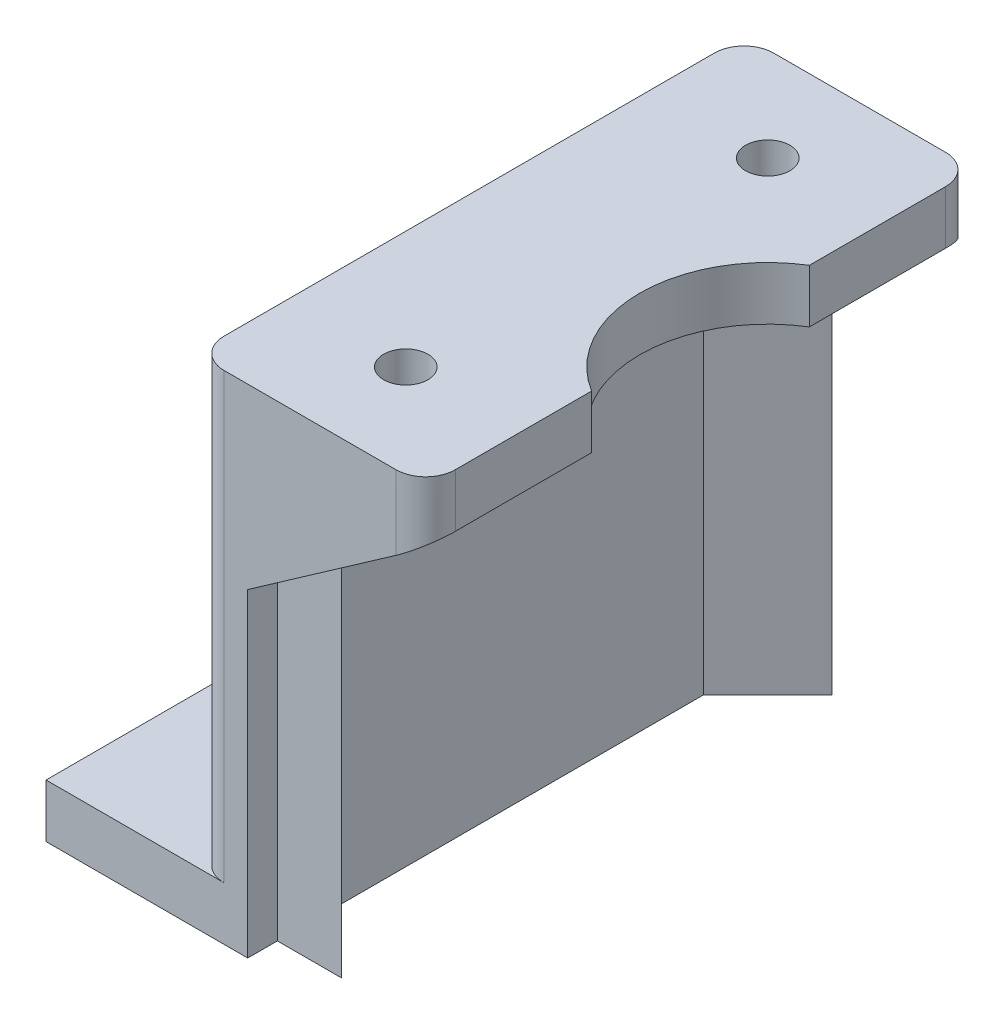
ISO-10303-21;
HEADER;
FILE_DESCRIPTION(('STEP AP214'),'2;1');
FILE_NAME('part.step','',(''),(''),'','','');
FILE_SCHEMA(('AUTOMOTIVE_DESIGN { 1 0 10303 214 1 1 1 1 }'));
ENDSEC;
DATA;
#1=APPLICATION_CONTEXT('core data for automotive mechanical design processes');
#2=APPLICATION_PROTOCOL_DEFINITION('international standard','automotive_design',2000,#1);
#3=PRODUCT_CONTEXT('',#1,'mechanical');
#4=PRODUCT('Part','Part','',(#3));
#5=PRODUCT_RELATED_PRODUCT_CATEGORY('part','',(#4));
#6=PRODUCT_DEFINITION_FORMATION('','',#4);
#7=PRODUCT_DEFINITION_CONTEXT('part definition',#1,'design');
#8=PRODUCT_DEFINITION('design','',#6,#7);
#9=PRODUCT_DEFINITION_SHAPE('','',#8);
#10=(LENGTH_UNIT() NAMED_UNIT(*) SI_UNIT(.MILLI.,.METRE.));
#11=(NAMED_UNIT(*) PLANE_ANGLE_UNIT() SI_UNIT($,.RADIAN.));
#12=(NAMED_UNIT(*) SI_UNIT($,.STERADIAN.) SOLID_ANGLE_UNIT());
#13=UNCERTAINTY_MEASURE_WITH_UNIT(LENGTH_MEASURE(1.E-05),#10,'distance_accuracy_value','');
#14=(GEOMETRIC_REPRESENTATION_CONTEXT(3) GLOBAL_UNCERTAINTY_ASSIGNED_CONTEXT((#13)) GLOBAL_UNIT_ASSIGNED_CONTEXT((#10,
#11,#12)) REPRESENTATION_CONTEXT('',''));
#15=CARTESIAN_POINT('',(0.,0.,0.));
#16=DIRECTION('',(0.,0.,1.));
#17=DIRECTION('',(1.,0.,0.));
#18=AXIS2_PLACEMENT_3D('',#15,#16,#17);
#19=CARTESIAN_POINT('',(0.,39.77894,47.0789));
#20=DIRECTION('',(0.,-1.,0.));
#21=DIRECTION('',(0.,0.,-1.));
#22=AXIS2_PLACEMENT_3D('',#19,#20,#21);
#23=PLANE('',#22);
#24=CARTESIAN_POINT('',(-36.4998,39.77894,8.0391));
#25=DIRECTION('',(0.,-1.,0.));
#26=DIRECTION('',(0.,0.,-1.));
#27=AXIS2_PLACEMENT_3D('',#24,#25,#26);
#28=CIRCLE('',#27,1.89864999999999);
#29=CARTESIAN_POINT('',(-36.4998,39.77894,6.14045000000001));
#30=VERTEX_POINT('',#29);
#31=EDGE_CURVE('E246',#30,#30,#28,.T.);
#32=ORIENTED_EDGE('',*,*,#31,.F.);
#33=EDGE_LOOP('',(#32));
#34=FACE_BOUND('',#33,.T.);
#35=CARTESIAN_POINT('',(-36.4998,39.77894,39.0398));
#36=DIRECTION('',(0.,-1.,0.));
#37=DIRECTION('',(0.,0.,-1.));
#38=AXIS2_PLACEMENT_3D('',#35,#36,#37);
#39=CIRCLE('',#38,1.89864999999999);
#40=CARTESIAN_POINT('',(-36.4998,39.77894,37.14115));
#41=VERTEX_POINT('',#40);
#42=EDGE_CURVE('E252',#41,#41,#39,.T.);
#43=ORIENTED_EDGE('',*,*,#42,.F.);
#44=EDGE_LOOP('',(#43));
#45=FACE_BOUND('',#44,.T.);
#46=DIRECTION('',(0.,0.,-1.));
#47=VECTOR('',#46,1.);
#48=CARTESIAN_POINT('',(-41.9989,39.77894,47.0789));
#49=LINE('',#48,#47);
#50=CARTESIAN_POINT('',(-41.9989,39.77894,39.0398));
#51=VERTEX_POINT('',#50);
#52=CARTESIAN_POINT('',(-41.9989,39.77894,8.0391));
#53=VERTEX_POINT('',#52);
#54=EDGE_CURVE('E320',#51,#53,#49,.T.);
#55=ORIENTED_EDGE('',*,*,#54,.T.);
#56=DIRECTION('',(-0.707106781186547,0.,0.707106781186547));
#57=VECTOR('',#56,1.);
#58=CARTESIAN_POINT('',(-36.4998,39.77894,2.54));
#59=LINE('',#58,#57);
#60=CARTESIAN_POINT('',(-36.4998,39.77894,2.54));
#61=VERTEX_POINT('',#60);
#62=EDGE_CURVE('E189',#61,#53,#59,.T.);
#63=ORIENTED_EDGE('',*,*,#62,.F.);
#64=DIRECTION('',(-1.,0.,0.));
#65=VECTOR('',#64,1.);
#66=CARTESIAN_POINT('',(-41.9989,39.77894,2.54));
#67=LINE('',#66,#65);
#68=CARTESIAN_POINT('',(-26.7589,39.77894,2.54));
#69=VERTEX_POINT('',#68);
#70=EDGE_CURVE('E256',#69,#61,#67,.T.);
#71=ORIENTED_EDGE('',*,*,#70,.F.);
#72=DIRECTION('',(0.,0.,-1.));
#73=VECTOR('',#72,1.);
#74=CARTESIAN_POINT('',(-26.7589,39.77894,47.0789));
#75=LINE('',#74,#73);
#76=CARTESIAN_POINT('',(-26.7589,39.77894,14.2138317846965));
#77=VERTEX_POINT('',#76);
#78=EDGE_CURVE('E316',#77,#69,#75,.T.);
#79=ORIENTED_EDGE('',*,*,#78,.F.);
#80=CARTESIAN_POINT('',(-21.00072,39.77894,23.53945));
#81=DIRECTION('',(0.,-1.,0.));
#82=DIRECTION('',(0.,0.,-1.));
#83=AXIS2_PLACEMENT_3D('',#80,#81,#82);
#84=CIRCLE('',#83,10.9601);
#85=CARTESIAN_POINT('',(-26.7589,39.77894,32.8650682153035));
#86=VERTEX_POINT('',#85);
#87=EDGE_CURVE('E240',#86,#77,#84,.T.);
#88=ORIENTED_EDGE('',*,*,#87,.F.);
#89=CARTESIAN_POINT('',(-26.7589,39.77894,44.5389));
#90=VERTEX_POINT('',#89);
#91=EDGE_CURVE('E319',#90,#86,#75,.T.);
#92=ORIENTED_EDGE('',*,*,#91,.F.);
#93=DIRECTION('',(-1.,0.,0.));
#94=VECTOR('',#93,1.);
#95=CARTESIAN_POINT('',(-41.9989,39.77894,44.5389));
#96=LINE('',#95,#94);
#97=CARTESIAN_POINT('',(-36.4998,39.77894,44.5389));
#98=VERTEX_POINT('',#97);
#99=EDGE_CURVE('E266',#90,#98,#96,.T.);
#100=ORIENTED_EDGE('',*,*,#99,.T.);
#101=DIRECTION('',(0.707106781186547,0.,0.707106781186547));
#102=VECTOR('',#101,1.);
#103=CARTESIAN_POINT('',(-41.9989,39.77894,39.0398));
#104=LINE('',#103,#102);
#105=EDGE_CURVE('E205',#51,#98,#104,.T.);
#106=ORIENTED_EDGE('',*,*,#105,.F.);
#107=EDGE_LOOP('',(#55,#63,#71,#79,#88,#92,#100,#106));
#108=FACE_BOUND('',#107,.T.);
#109=ADVANCED_FACE('F35',(#34,#45,#108),#23,.T.);
#110=CARTESIAN_POINT('',(-41.9989,0.,47.0789));
#111=DIRECTION('',(1.,0.,0.));
#112=DIRECTION('',(0.,1.,0.));
#113=AXIS2_PLACEMENT_3D('',#110,#111,#112);
#114=PLANE('',#113);
#115=DIRECTION('',(0.,0.,-1.));
#116=VECTOR('',#115,1.);
#117=CARTESIAN_POINT('',(-41.9989,29.1109399999997,2.54));
#118=LINE('',#117,#116);
#119=CARTESIAN_POINT('',(-41.9989,29.1109399999997,2.54));
#120=VERTEX_POINT('',#119);
#121=CARTESIAN_POINT('',(-41.9989,29.1109399999998,0.));
#122=VERTEX_POINT('',#121);
#123=EDGE_CURVE('E260',#120,#122,#118,.T.);
#124=ORIENTED_EDGE('',*,*,#123,.F.);
#125=DIRECTION('',(0.,1.,0.));
#126=VECTOR('',#125,1.);
#127=CARTESIAN_POINT('',(-41.9989,1.778,2.54));
#128=LINE('',#127,#126);
#129=CARTESIAN_POINT('',(-41.9989,1.778,2.53999999999999));
#130=VERTEX_POINT('',#129);
#131=EDGE_CURVE('E58',#130,#120,#128,.T.);
#132=ORIENTED_EDGE('',*,*,#131,.F.);
#133=DIRECTION('',(0.,0.,-1.));
#134=VECTOR('',#133,1.);
#135=CARTESIAN_POINT('',(-41.9989,1.778,47.0789));
#136=LINE('',#135,#134);
#137=CARTESIAN_POINT('',(-41.9989,1.778,0.));
#138=VERTEX_POINT('',#137);
#139=EDGE_CURVE('E187',#130,#138,#136,.T.);
#140=ORIENTED_EDGE('',*,*,#139,.T.);
#141=DIRECTION('',(0.,-1.,0.));
#142=VECTOR('',#141,1.);
#143=CARTESIAN_POINT('',(-41.9989,0.,0.));
#144=LINE('',#143,#142);
#145=EDGE_CURVE('E298',#122,#138,#144,.T.);
#146=ORIENTED_EDGE('',*,*,#145,.F.);
#147=EDGE_LOOP('',(#124,#132,#140,#146));
#148=FACE_BOUND('',#147,.T.);
#149=ADVANCED_FACE('F450',(#148),#114,.T.);
#150=CARTESIAN_POINT('',(-41.9989,1.778,39.0398));
#151=VERTEX_POINT('',#150);
#152=CARTESIAN_POINT('',(-41.9989,1.778,8.03910000000002));
#153=VERTEX_POINT('',#152);
#154=EDGE_CURVE('E325',#151,#153,#136,.T.);
#155=ORIENTED_EDGE('',*,*,#154,.T.);
#156=DIRECTION('',(0.,1.,0.));
#157=VECTOR('',#156,1.);
#158=CARTESIAN_POINT('',(-41.9989,1.778,8.0391));
#159=LINE('',#158,#157);
#160=EDGE_CURVE('E50',#153,#53,#159,.T.);
#161=ORIENTED_EDGE('',*,*,#160,.T.);
#162=ORIENTED_EDGE('',*,*,#54,.F.);
#163=DIRECTION('',(0.,1.,0.));
#164=VECTOR('',#163,1.);
#165=CARTESIAN_POINT('',(-41.9989,1.778,39.0398));
#166=LINE('',#165,#164);
#167=EDGE_CURVE('E216',#151,#51,#166,.T.);
#168=ORIENTED_EDGE('',*,*,#167,.F.);
#169=EDGE_LOOP('',(#155,#161,#162,#168));
#170=FACE_BOUND('',#169,.T.);
#171=ADVANCED_FACE('F380',(#170),#114,.T.);
#172=CARTESIAN_POINT('',(0.,0.,2.54));
#173=DIRECTION('',(0.,0.,-1.));
#174=DIRECTION('',(1.,0.,0.));
#175=AXIS2_PLACEMENT_3D('',#172,#173,#174);
#176=PLANE('',#175);
#177=DIRECTION('',(0.,1.,0.));
#178=VECTOR('',#177,1.);
#179=CARTESIAN_POINT('',(-36.4998,0.,2.54));
#180=LINE('',#179,#178);
#181=CARTESIAN_POINT('',(-36.4998,32.9603099999998,2.54));
#182=VERTEX_POINT('',#181);
#183=EDGE_CURVE('E11',#182,#61,#180,.T.);
#184=ORIENTED_EDGE('',*,*,#183,.F.);
#185=DIRECTION('',(0.819231920519033,0.573462344363338,0.));
#186=VECTOR('',#185,1.);
#187=CARTESIAN_POINT('',(-26.7589,39.77894,2.54));
#188=LINE('',#187,#186);
#189=EDGE_CURVE('E258',#182,#69,#188,.T.);
#190=ORIENTED_EDGE('',*,*,#189,.T.);
#191=ORIENTED_EDGE('',*,*,#70,.T.);
#192=EDGE_LOOP('',(#184,#190,#191));
#193=FACE_BOUND('',#192,.T.);
#194=ADVANCED_FACE('F386',(#193),#176,.F.);
#195=CARTESIAN_POINT('',(-41.9989,1.778,47.0789));
#196=VERTEX_POINT('',#195);
#197=CARTESIAN_POINT('',(-41.9989,1.778,44.5389));
#198=VERTEX_POINT('',#197);
#199=EDGE_CURVE('E322',#196,#198,#136,.T.);
#200=ORIENTED_EDGE('',*,*,#199,.T.);
#201=DIRECTION('',(0.,1.,0.));
#202=VECTOR('',#201,1.);
#203=CARTESIAN_POINT('',(-41.9989,1.778,44.5389));
#204=LINE('',#203,#202);
#205=CARTESIAN_POINT('',(-41.9989,29.1109399999997,44.5389));
#206=VERTEX_POINT('',#205);
#207=EDGE_CURVE('E219',#198,#206,#204,.T.);
#208=ORIENTED_EDGE('',*,*,#207,.T.);
#209=DIRECTION('',(0.,0.,1.));
#210=VECTOR('',#209,1.);
#211=CARTESIAN_POINT('',(-41.9989,29.1109399999997,44.5389));
#212=LINE('',#211,#210);
#213=CARTESIAN_POINT('',(-41.9989,29.1109399999997,47.0789));
#214=VERTEX_POINT('',#213);
#215=EDGE_CURVE('E272',#206,#214,#212,.T.);
#216=ORIENTED_EDGE('',*,*,#215,.T.);
#217=DIRECTION('',(0.,-1.,0.));
#218=VECTOR('',#217,1.);
#219=CARTESIAN_POINT('',(-41.9989,0.,47.0789));
#220=LINE('',#219,#218);
#221=EDGE_CURVE('E285',#214,#196,#220,.T.);
#222=ORIENTED_EDGE('',*,*,#221,.T.);
#223=EDGE_LOOP('',(#200,#208,#216,#222));
#224=FACE_BOUND('',#223,.T.);
#225=ADVANCED_FACE('F443',(#224),#114,.T.);
#226=CARTESIAN_POINT('',(0.,0.,44.5389));
#227=DIRECTION('',(0.,0.,1.));
#228=DIRECTION('',(1.,0.,0.));
#229=AXIS2_PLACEMENT_3D('',#226,#227,#228);
#230=PLANE('',#229);
#231=DIRECTION('',(0.,-1.,0.));
#232=VECTOR('',#231,1.);
#233=CARTESIAN_POINT('',(-36.4998,0.,44.5389));
#234=LINE('',#233,#232);
#235=CARTESIAN_POINT('',(-36.4998,32.9603099999998,44.5389));
#236=VERTEX_POINT('',#235);
#237=EDGE_CURVE('E43',#98,#236,#234,.T.);
#238=ORIENTED_EDGE('',*,*,#237,.F.);
#239=ORIENTED_EDGE('',*,*,#99,.F.);
#240=DIRECTION('',(0.819231920519033,0.573462344363338,0.));
#241=VECTOR('',#240,1.);
#242=CARTESIAN_POINT('',(-26.7589,39.77894,44.5389));
#243=LINE('',#242,#241);
#244=EDGE_CURVE('E269',#236,#90,#243,.T.);
#245=ORIENTED_EDGE('',*,*,#244,.F.);
#246=EDGE_LOOP('',(#238,#239,#245));
#247=FACE_BOUND('',#246,.T.);
#248=ADVANCED_FACE('F438',(#247),#230,.F.);
#249=CARTESIAN_POINT('',(-26.7589,0.,47.0789));
#250=DIRECTION('',(1.,0.,0.));
#251=DIRECTION('',(0.,0.,-1.));
#252=AXIS2_PLACEMENT_3D('',#249,#250,#251);
#253=PLANE('',#252);
#254=ORIENTED_EDGE('',*,*,#78,.T.);
#255=DIRECTION('',(0.,-1.,0.));
#256=VECTOR('',#255,1.);
#257=CARTESIAN_POINT('',(-26.7589,44.35094,2.54));
#258=LINE('',#257,#256);
#259=CARTESIAN_POINT('',(-26.7589,44.35094,2.54));
#260=VERTEX_POINT('',#259);
#261=EDGE_CURVE('E359',#69,#260,#258,.F.);
#262=ORIENTED_EDGE('',*,*,#261,.T.);
#263=DIRECTION('',(0.,0.,-1.));
#264=VECTOR('',#263,1.);
#265=CARTESIAN_POINT('',(-26.7589,44.35094,47.0789));
#266=LINE('',#265,#264);
#267=CARTESIAN_POINT('',(-26.7589,44.35094,14.2138317846965));
#268=VERTEX_POINT('',#267);
#269=EDGE_CURVE('E313',#268,#260,#266,.T.);
#270=ORIENTED_EDGE('',*,*,#269,.F.);
#271=DIRECTION('',(0.,1.,0.));
#272=VECTOR('',#271,1.);
#273=CARTESIAN_POINT('',(-26.7589,1.77799999999999,14.2138317846965));
#274=LINE('',#273,#272);
#275=EDGE_CURVE('E236',#77,#268,#274,.T.);
#276=ORIENTED_EDGE('',*,*,#275,.F.);
#277=EDGE_LOOP('',(#254,#262,#270,#276));
#278=FACE_BOUND('',#277,.T.);
#279=ADVANCED_FACE('F395',(#278),#253,.T.);
#280=CARTESIAN_POINT('',(-59.2709,0.,47.0789));
#281=DIRECTION('',(-1.,0.,0.));
#282=DIRECTION('',(0.,0.,1.));
#283=AXIS2_PLACEMENT_3D('',#280,#281,#282);
#284=PLANE('',#283);
#285=DIRECTION('',(0.,1.,0.));
#286=VECTOR('',#285,1.);
#287=CARTESIAN_POINT('',(-59.2709,0.,0.));
#288=LINE('',#287,#286);
#289=CARTESIAN_POINT('',(-59.2709,1.77799999999999,0.));
#290=VERTEX_POINT('',#289);
#291=CARTESIAN_POINT('',(-59.2709,6.34999999999999,0.));
#292=VERTEX_POINT('',#291);
#293=EDGE_CURVE('E277',#290,#292,#288,.T.);
#294=ORIENTED_EDGE('',*,*,#293,.F.);
#295=DIRECTION('',(0.,0.,-1.));
#296=VECTOR('',#295,1.);
#297=CARTESIAN_POINT('',(-59.2709,1.77799999999999,47.0789));
#298=LINE('',#297,#296);
#299=CARTESIAN_POINT('',(-59.2709,1.77799999999999,47.0789));
#300=VERTEX_POINT('',#299);
#301=EDGE_CURVE('E324',#300,#290,#298,.T.);
#302=ORIENTED_EDGE('',*,*,#301,.F.);
#303=DIRECTION('',(0.,1.,0.));
#304=VECTOR('',#303,1.);
#305=CARTESIAN_POINT('',(-59.2709,0.,47.0789));
#306=LINE('',#305,#304);
#307=CARTESIAN_POINT('',(-59.2709,6.34999999999999,47.0789));
#308=VERTEX_POINT('',#307);
#309=EDGE_CURVE('E278',#300,#308,#306,.T.);
#310=ORIENTED_EDGE('',*,*,#309,.T.);
#311=DIRECTION('',(0.,0.,-1.));
#312=VECTOR('',#311,1.);
#313=CARTESIAN_POINT('',(-59.2709,6.34999999999999,47.0789));
#314=LINE('',#313,#312);
#315=EDGE_CURVE('E292',#308,#292,#314,.T.);
#316=ORIENTED_EDGE('',*,*,#315,.T.);
#317=EDGE_LOOP('',(#294,#302,#310,#316));
#318=FACE_BOUND('',#317,.T.);
#319=ADVANCED_FACE('F447',(#318),#284,.T.);
#320=CARTESIAN_POINT('',(0.,1.778,47.0789));
#321=DIRECTION('',(0.,-1.,0.));
#322=DIRECTION('',(1.,0.,0.));
#323=AXIS2_PLACEMENT_3D('',#320,#321,#322);
#324=PLANE('',#323);
#325=CARTESIAN_POINT('',(-52.9209,1.77799999999999,10.83945));
#326=DIRECTION('',(0.,1.,0.));
#327=DIRECTION('',(0.,0.,1.));
#328=AXIS2_PLACEMENT_3D('',#325,#326,#327);
#329=CIRCLE('',#328,1.89864999999999);
#330=CARTESIAN_POINT('',(-52.9209,1.77799999999999,12.7381));
#331=VERTEX_POINT('',#330);
#332=EDGE_CURVE('E224',#331,#331,#329,.T.);
#333=ORIENTED_EDGE('',*,*,#332,.T.);
#334=EDGE_LOOP('',(#333));
#335=FACE_BOUND('',#334,.T.);
#336=CARTESIAN_POINT('',(-52.9209,1.77799999999999,36.23945));
#337=DIRECTION('',(0.,1.,0.));
#338=DIRECTION('',(0.,0.,1.));
#339=AXIS2_PLACEMENT_3D('',#336,#337,#338);
#340=CIRCLE('',#339,1.89864999999999);
#341=CARTESIAN_POINT('',(-52.9209,1.77799999999999,38.1381));
#342=VERTEX_POINT('',#341);
#343=EDGE_CURVE('E230',#342,#342,#340,.T.);
#344=ORIENTED_EDGE('',*,*,#343,.T.);
#345=EDGE_LOOP('',(#344));
#346=FACE_BOUND('',#345,.T.);
#347=DIRECTION('',(-1.,0.,0.));
#348=VECTOR('',#347,1.);
#349=CARTESIAN_POINT('',(0.,1.778,0.));
#350=LINE('',#349,#348);
#351=EDGE_CURVE('E295',#138,#290,#350,.T.);
#352=ORIENTED_EDGE('',*,*,#351,.F.);
#353=ORIENTED_EDGE('',*,*,#139,.F.);
#354=DIRECTION('',(1.,0.,0.));
#355=VECTOR('',#354,1.);
#356=CARTESIAN_POINT('',(-41.9989,1.778,2.54));
#357=LINE('',#356,#355);
#358=CARTESIAN_POINT('',(-36.4998,1.778,2.54));
#359=VERTEX_POINT('',#358);
#360=EDGE_CURVE('E180',#130,#359,#357,.T.);
#361=ORIENTED_EDGE('',*,*,#360,.T.);
#362=DIRECTION('',(-0.707106781186547,0.,0.707106781186547));
#363=VECTOR('',#362,1.);
#364=CARTESIAN_POINT('',(-36.4998,1.778,2.54));
#365=LINE('',#364,#363);
#366=EDGE_CURVE('E186',#359,#153,#365,.T.);
#367=ORIENTED_EDGE('',*,*,#366,.T.);
#368=ORIENTED_EDGE('',*,*,#154,.F.);
#369=DIRECTION('',(0.707106781186547,0.,0.707106781186547));
#370=VECTOR('',#369,1.);
#371=CARTESIAN_POINT('',(-41.9989,1.778,39.0398));
#372=LINE('',#371,#370);
#373=CARTESIAN_POINT('',(-36.4998,1.778,44.5389));
#374=VERTEX_POINT('',#373);
#375=EDGE_CURVE('E209',#151,#374,#372,.T.);
#376=ORIENTED_EDGE('',*,*,#375,.T.);
#377=DIRECTION('',(-1.,0.,0.));
#378=VECTOR('',#377,1.);
#379=CARTESIAN_POINT('',(-36.4998,1.778,44.5389));
#380=LINE('',#379,#378);
#381=EDGE_CURVE('E206',#374,#198,#380,.T.);
#382=ORIENTED_EDGE('',*,*,#381,.T.);
#383=ORIENTED_EDGE('',*,*,#199,.F.);
#384=DIRECTION('',(-1.,0.,0.));
#385=VECTOR('',#384,1.);
#386=CARTESIAN_POINT('',(0.,1.778,47.0789));
#387=LINE('',#386,#385);
#388=EDGE_CURVE('E281',#196,#300,#387,.T.);
#389=ORIENTED_EDGE('',*,*,#388,.T.);
#390=ORIENTED_EDGE('',*,*,#301,.T.);
#391=EDGE_LOOP('',(#352,#353,#361,#367,#368,#376,#382,#383,#389,#390));
#392=FACE_BOUND('',#391,.T.);
#393=ADVANCED_FACE('F183',(#335,#346,#392),#324,.T.);
#394=CARTESIAN_POINT('',(-26.7589,44.35094,44.5389));
#395=VERTEX_POINT('',#394);
#396=CARTESIAN_POINT('',(-26.7589,44.35094,32.8650682153035));
#397=VERTEX_POINT('',#396);
#398=EDGE_CURVE('E314',#395,#397,#266,.T.);
#399=ORIENTED_EDGE('',*,*,#398,.F.);
#400=DIRECTION('',(0.,-1.,0.));
#401=VECTOR('',#400,1.);
#402=CARTESIAN_POINT('',(-26.7589,0.,44.5389));
#403=LINE('',#402,#401);
#404=EDGE_CURVE('E351',#395,#90,#403,.T.);
#405=ORIENTED_EDGE('',*,*,#404,.T.);
#406=ORIENTED_EDGE('',*,*,#91,.T.);
#407=DIRECTION('',(0.,1.,0.));
#408=VECTOR('',#407,1.);
#409=CARTESIAN_POINT('',(-26.7589,1.77799999999999,32.8650682153035));
#410=LINE('',#409,#408);
#411=EDGE_CURVE('E237',#86,#397,#410,.T.);
#412=ORIENTED_EDGE('',*,*,#411,.T.);
#413=EDGE_LOOP('',(#399,#405,#406,#412));
#414=FACE_BOUND('',#413,.T.);
#415=ADVANCED_FACE('F433',(#414),#253,.T.);
#416=CARTESIAN_POINT('',(0.,44.35094,47.0789));
#417=DIRECTION('',(0.,1.,0.));
#418=DIRECTION('',(-1.,0.,0.));
#419=AXIS2_PLACEMENT_3D('',#416,#417,#418);
#420=PLANE('',#419);
#421=DIRECTION('',(1.,0.,0.));
#422=VECTOR('',#421,1.);
#423=CARTESIAN_POINT('',(0.,44.35094,0.));
#424=LINE('',#423,#422);
#425=CARTESIAN_POINT('',(-44.0309,44.35094,0.));
#426=VERTEX_POINT('',#425);
#427=CARTESIAN_POINT('',(-29.2989,44.35094,0.));
#428=VERTEX_POINT('',#427);
#429=EDGE_CURVE('E301',#426,#428,#424,.T.);
#430=ORIENTED_EDGE('',*,*,#429,.F.);
#431=CARTESIAN_POINT('',(-44.0309,44.35094,2.54));
#432=DIRECTION('',(0.,1.,0.));
#433=DIRECTION('',(-1.,0.,0.));
#434=AXIS2_PLACEMENT_3D('',#431,#432,#433);
#435=CIRCLE('',#434,2.54);
#436=CARTESIAN_POINT('',(-46.5709,44.35094,2.54));
#437=VERTEX_POINT('',#436);
#438=EDGE_CURVE('E339',#426,#437,#435,.T.);
#439=ORIENTED_EDGE('',*,*,#438,.T.);
#440=DIRECTION('',(0.,0.,-1.));
#441=VECTOR('',#440,1.);
#442=CARTESIAN_POINT('',(-46.5709,44.35094,47.0789));
#443=LINE('',#442,#441);
#444=CARTESIAN_POINT('',(-46.5709,44.35094,44.5389));
#445=VERTEX_POINT('',#444);
#446=EDGE_CURVE('E310',#445,#437,#443,.T.);
#447=ORIENTED_EDGE('',*,*,#446,.F.);
#448=CARTESIAN_POINT('',(-44.0309,44.35094,44.5389));
#449=DIRECTION('',(0.,1.,0.));
#450=DIRECTION('',(-1.,0.,0.));
#451=AXIS2_PLACEMENT_3D('',#448,#449,#450);
#452=CIRCLE('',#451,2.54);
#453=CARTESIAN_POINT('',(-44.0309,44.35094,47.0789));
#454=VERTEX_POINT('',#453);
#455=EDGE_CURVE('E337',#445,#454,#452,.T.);
#456=ORIENTED_EDGE('',*,*,#455,.T.);
#457=DIRECTION('',(1.,0.,0.));
#458=VECTOR('',#457,1.);
#459=CARTESIAN_POINT('',(0.,44.35094,47.0789));
#460=LINE('',#459,#458);
#461=CARTESIAN_POINT('',(-29.2989,44.35094,47.0789));
#462=VERTEX_POINT('',#461);
#463=EDGE_CURVE('E287',#454,#462,#460,.T.);
#464=ORIENTED_EDGE('',*,*,#463,.T.);
#465=CARTESIAN_POINT('',(-29.2989,44.35094,44.5389));
#466=DIRECTION('',(0.,1.,0.));
#467=DIRECTION('',(-1.,0.,0.));
#468=AXIS2_PLACEMENT_3D('',#465,#466,#467);
#469=CIRCLE('',#468,2.54);
#470=EDGE_CURVE('E335',#462,#395,#469,.T.);
#471=ORIENTED_EDGE('',*,*,#470,.T.);
#472=ORIENTED_EDGE('',*,*,#398,.T.);
#473=CARTESIAN_POINT('',(-21.00072,44.35094,23.53945));
#474=DIRECTION('',(0.,1.,0.));
#475=DIRECTION('',(0.,0.,1.));
#476=AXIS2_PLACEMENT_3D('',#473,#474,#475);
#477=CIRCLE('',#476,10.9601);
#478=EDGE_CURVE('E233',#268,#397,#477,.T.);
#479=ORIENTED_EDGE('',*,*,#478,.F.);
#480=ORIENTED_EDGE('',*,*,#269,.T.);
#481=CARTESIAN_POINT('',(-29.2989,44.35094,2.54));
#482=DIRECTION('',(0.,1.,0.));
#483=DIRECTION('',(-1.,0.,0.));
#484=AXIS2_PLACEMENT_3D('',#481,#482,#483);
#485=CIRCLE('',#484,2.54);
#486=EDGE_CURVE('E333',#260,#428,#485,.T.);
#487=ORIENTED_EDGE('',*,*,#486,.T.);
#488=EDGE_LOOP('',(#430,#439,#447,#456,#464,#471,#472,#479,#480,#487));
#489=FACE_BOUND('',#488,.T.);
#490=CARTESIAN_POINT('',(-36.4998,44.35094,8.0391));
#491=DIRECTION('',(0.,1.,0.));
#492=DIRECTION('',(0.,0.,1.));
#493=AXIS2_PLACEMENT_3D('',#490,#491,#492);
#494=CIRCLE('',#493,1.89864999999999);
#495=CARTESIAN_POINT('',(-36.4998,44.35094,9.93774999999999));
#496=VERTEX_POINT('',#495);
#497=EDGE_CURVE('E243',#496,#496,#494,.T.);
#498=ORIENTED_EDGE('',*,*,#497,.F.);
#499=EDGE_LOOP('',(#498));
#500=FACE_BOUND('',#499,.T.);
#501=CARTESIAN_POINT('',(-36.4998,44.35094,39.0398));
#502=DIRECTION('',(0.,1.,0.));
#503=DIRECTION('',(0.,0.,1.));
#504=AXIS2_PLACEMENT_3D('',#501,#502,#503);
#505=CIRCLE('',#504,1.89864999999999);
#506=CARTESIAN_POINT('',(-36.4998,44.35094,40.93845));
#507=VERTEX_POINT('',#506);
#508=EDGE_CURVE('E249',#507,#507,#505,.T.);
#509=ORIENTED_EDGE('',*,*,#508,.F.);
#510=EDGE_LOOP('',(#509));
#511=FACE_BOUND('',#510,.T.);
#512=ADVANCED_FACE('F402',(#489,#500,#511),#420,.T.);
#513=CARTESIAN_POINT('',(-46.5709,0.,47.0789));
#514=DIRECTION('',(-1.,0.,0.));
#515=DIRECTION('',(0.,0.,1.));
#516=AXIS2_PLACEMENT_3D('',#513,#514,#515);
#517=PLANE('',#516);
#518=ORIENTED_EDGE('',*,*,#446,.T.);
#519=DIRECTION('',(0.,1.,0.));
#520=VECTOR('',#519,1.);
#521=CARTESIAN_POINT('',(-46.5709,6.35,2.54));
#522=LINE('',#521,#520);
#523=CARTESIAN_POINT('',(-46.5709,6.35,2.54));
#524=VERTEX_POINT('',#523);
#525=EDGE_CURVE('E344',#437,#524,#522,.F.);
#526=ORIENTED_EDGE('',*,*,#525,.T.);
#527=DIRECTION('',(0.,0.,-1.));
#528=VECTOR('',#527,1.);
#529=CARTESIAN_POINT('',(-46.5709,6.35,47.0789));
#530=LINE('',#529,#528);
#531=CARTESIAN_POINT('',(-46.5709,6.35,44.5389));
#532=VERTEX_POINT('',#531);
#533=EDGE_CURVE('E307',#532,#524,#530,.T.);
#534=ORIENTED_EDGE('',*,*,#533,.F.);
#535=DIRECTION('',(0.,1.,0.));
#536=VECTOR('',#535,1.);
#537=CARTESIAN_POINT('',(-46.5709,0.,44.5389));
#538=LINE('',#537,#536);
#539=EDGE_CURVE('E341',#532,#445,#538,.T.);
#540=ORIENTED_EDGE('',*,*,#539,.T.);
#541=EDGE_LOOP('',(#518,#526,#534,#540));
#542=FACE_BOUND('',#541,.T.);
#543=ADVANCED_FACE('F414',(#542),#517,.T.);
#544=CARTESIAN_POINT('',(0.,6.35,47.0789));
#545=DIRECTION('',(0.,-1.,0.));
#546=DIRECTION('',(1.,0.,0.));
#547=AXIS2_PLACEMENT_3D('',#544,#545,#546);
#548=PLANE('',#547);
#549=CARTESIAN_POINT('',(-52.9209,6.35,10.83945));
#550=DIRECTION('',(0.,1.,0.));
#551=DIRECTION('',(0.,0.,1.));
#552=AXIS2_PLACEMENT_3D('',#549,#550,#551);
#553=CIRCLE('',#552,1.89864999999999);
#554=CARTESIAN_POINT('',(-52.9209,6.35,12.7381));
#555=VERTEX_POINT('',#554);
#556=EDGE_CURVE('E221',#555,#555,#553,.T.);
#557=ORIENTED_EDGE('',*,*,#556,.F.);
#558=EDGE_LOOP('',(#557));
#559=FACE_BOUND('',#558,.T.);
#560=CARTESIAN_POINT('',(-52.9209,6.35,36.23945));
#561=DIRECTION('',(0.,1.,0.));
#562=DIRECTION('',(0.,0.,1.));
#563=AXIS2_PLACEMENT_3D('',#560,#561,#562);
#564=CIRCLE('',#563,1.89864999999999);
#565=CARTESIAN_POINT('',(-52.9209,6.35,38.1381));
#566=VERTEX_POINT('',#565);
#567=EDGE_CURVE('E227',#566,#566,#564,.T.);
#568=ORIENTED_EDGE('',*,*,#567,.F.);
#569=EDGE_LOOP('',(#568));
#570=FACE_BOUND('',#569,.T.);
#571=DIRECTION('',(-1.,0.,0.));
#572=VECTOR('',#571,1.);
#573=CARTESIAN_POINT('',(0.,6.35,0.));
#574=LINE('',#573,#572);
#575=CARTESIAN_POINT('',(-44.0309,6.35,0.));
#576=VERTEX_POINT('',#575);
#577=EDGE_CURVE('E282',#576,#292,#574,.T.);
#578=ORIENTED_EDGE('',*,*,#577,.T.);
#579=ORIENTED_EDGE('',*,*,#315,.F.);
#580=DIRECTION('',(-1.,0.,0.));
#581=VECTOR('',#580,1.);
#582=CARTESIAN_POINT('',(0.,6.35,47.0789));
#583=LINE('',#582,#581);
#584=CARTESIAN_POINT('',(-44.0309,6.35,47.0789));
#585=VERTEX_POINT('',#584);
#586=EDGE_CURVE('E290',#585,#308,#583,.T.);
#587=ORIENTED_EDGE('',*,*,#586,.F.);
#588=CARTESIAN_POINT('',(-44.0309,6.35,44.5389));
#589=DIRECTION('',(0.,-1.,0.));
#590=DIRECTION('',(1.,0.,0.));
#591=AXIS2_PLACEMENT_3D('',#588,#589,#590);
#592=CIRCLE('',#591,2.54);
#593=EDGE_CURVE('E364',#585,#532,#592,.T.);
#594=ORIENTED_EDGE('',*,*,#593,.T.);
#595=ORIENTED_EDGE('',*,*,#533,.T.);
#596=CARTESIAN_POINT('',(-44.0309,6.35,2.54));
#597=DIRECTION('',(0.,-1.,0.));
#598=DIRECTION('',(1.,0.,0.));
#599=AXIS2_PLACEMENT_3D('',#596,#597,#598);
#600=CIRCLE('',#599,2.54);
#601=EDGE_CURVE('E361',#524,#576,#600,.T.);
#602=ORIENTED_EDGE('',*,*,#601,.T.);
#603=EDGE_LOOP('',(#578,#579,#587,#594,#595,#602));
#604=FACE_BOUND('',#603,.T.);
#605=ADVANCED_FACE('F479',(#559,#570,#604),#548,.F.);
#606=CARTESIAN_POINT('',(0.,0.,47.0789));
#607=DIRECTION('',(0.,0.,1.));
#608=DIRECTION('',(1.,0.,0.));
#609=AXIS2_PLACEMENT_3D('',#606,#607,#608);
#610=PLANE('',#609);
#611=ORIENTED_EDGE('',*,*,#463,.F.);
#612=DIRECTION('',(0.,1.,0.));
#613=VECTOR('',#612,1.);
#614=CARTESIAN_POINT('',(-44.0309,0.,47.0789));
#615=LINE('',#614,#613);
#616=EDGE_CURVE('E348',#454,#585,#615,.F.);
#617=ORIENTED_EDGE('',*,*,#616,.T.);
#618=ORIENTED_EDGE('',*,*,#586,.T.);
#619=ORIENTED_EDGE('',*,*,#309,.F.);
#620=ORIENTED_EDGE('',*,*,#388,.F.);
#621=ORIENTED_EDGE('',*,*,#221,.F.);
#622=DIRECTION('',(0.819231920519033,0.573462344363338,0.));
#623=VECTOR('',#622,1.);
#624=CARTESIAN_POINT('',(-26.7589,39.77894,47.0789));
#625=LINE('',#624,#623);
#626=CARTESIAN_POINT('',(-29.2989,38.00094,47.0789));
#627=VERTEX_POINT('',#626);
#628=EDGE_CURVE('E265',#214,#627,#625,.T.);
#629=ORIENTED_EDGE('',*,*,#628,.T.);
#630=DIRECTION('',(0.,-1.,0.));
#631=VECTOR('',#630,1.);
#632=CARTESIAN_POINT('',(-29.2989,0.,47.0789));
#633=LINE('',#632,#631);
#634=EDGE_CURVE('E346',#627,#462,#633,.F.);
#635=ORIENTED_EDGE('',*,*,#634,.T.);
#636=EDGE_LOOP('',(#611,#617,#618,#619,#620,#621,#629,#635));
#637=FACE_BOUND('',#636,.T.);
#638=ADVANCED_FACE('F424',(#637),#610,.T.);
#639=CARTESIAN_POINT('',(0.,0.,0.));
#640=DIRECTION('',(0.,0.,1.));
#641=DIRECTION('',(1.,0.,0.));
#642=AXIS2_PLACEMENT_3D('',#639,#640,#641);
#643=PLANE('',#642);
#644=ORIENTED_EDGE('',*,*,#577,.F.);
#645=DIRECTION('',(0.,1.,0.));
#646=VECTOR('',#645,1.);
#647=CARTESIAN_POINT('',(-44.0309,44.35094,0.));
#648=LINE('',#647,#646);
#649=EDGE_CURVE('E330',#576,#426,#648,.T.);
#650=ORIENTED_EDGE('',*,*,#649,.T.);
#651=ORIENTED_EDGE('',*,*,#429,.T.);
#652=DIRECTION('',(0.,-1.,0.));
#653=VECTOR('',#652,1.);
#654=CARTESIAN_POINT('',(-29.2989,39.77894,0.));
#655=LINE('',#654,#653);
#656=CARTESIAN_POINT('',(-29.2989,38.00094,0.));
#657=VERTEX_POINT('',#656);
#658=EDGE_CURVE('E327',#428,#657,#655,.T.);
#659=ORIENTED_EDGE('',*,*,#658,.T.);
#660=DIRECTION('',(0.819231920519033,0.573462344363338,0.));
#661=VECTOR('',#660,1.);
#662=CARTESIAN_POINT('',(-26.7589,39.77894,0.));
#663=LINE('',#662,#661);
#664=EDGE_CURVE('E255',#122,#657,#663,.T.);
#665=ORIENTED_EDGE('',*,*,#664,.F.);
#666=ORIENTED_EDGE('',*,*,#145,.T.);
#667=ORIENTED_EDGE('',*,*,#351,.T.);
#668=ORIENTED_EDGE('',*,*,#293,.T.);
#669=EDGE_LOOP('',(#644,#650,#651,#659,#665,#666,#667,#668));
#670=FACE_BOUND('',#669,.T.);
#671=ADVANCED_FACE('F406',(#670),#643,.F.);
#672=CARTESIAN_POINT('',(-26.7589,39.77894,44.5389));
#673=DIRECTION('',(0.573462344363338,-0.819231920519033,0.));
#674=DIRECTION('',(0.819231920519034,0.573462344363338,0.));
#675=AXIS2_PLACEMENT_3D('',#672,#673,#674);
#676=PLANE('',#675);
#677=EDGE_CURVE('E270',#206,#236,#243,.T.);
#678=ORIENTED_EDGE('',*,*,#677,.T.);
#679=ORIENTED_EDGE('',*,*,#244,.T.);
#680=CARTESIAN_POINT('',(-29.2989,38.00094,44.5389));
#681=DIRECTION('',(0.573462344363338,-0.819231920519033,0.));
#682=DIRECTION('',(-0.819231920519034,-0.573462344363338,0.));
#683=AXIS2_PLACEMENT_3D('',#680,#681,#682);
#684=ELLIPSE('',#683,3.10046512639639,2.54);
#685=EDGE_CURVE('E354',#90,#627,#684,.T.);
#686=ORIENTED_EDGE('',*,*,#685,.T.);
#687=ORIENTED_EDGE('',*,*,#628,.F.);
#688=ORIENTED_EDGE('',*,*,#215,.F.);
#689=EDGE_LOOP('',(#678,#679,#686,#687,#688));
#690=FACE_BOUND('',#689,.T.);
#691=ADVANCED_FACE('F440',(#690),#676,.T.);
#692=CARTESIAN_POINT('',(-26.7589,39.77894,2.54));
#693=DIRECTION('',(-0.573462344363338,0.819231920519033,0.));
#694=DIRECTION('',(-0.819231920519034,-0.573462344363338,0.));
#695=AXIS2_PLACEMENT_3D('',#692,#693,#694);
#696=PLANE('',#695);
#697=ORIENTED_EDGE('',*,*,#664,.T.);
#698=CARTESIAN_POINT('',(-29.2989,38.00094,2.54));
#699=DIRECTION('',(-0.573462344363338,0.819231920519033,0.));
#700=DIRECTION('',(0.819231920519034,0.573462344363338,0.));
#701=AXIS2_PLACEMENT_3D('',#698,#699,#700);
#702=ELLIPSE('',#701,3.10046512639639,2.54);
#703=EDGE_CURVE('E356',#657,#69,#702,.F.);
#704=ORIENTED_EDGE('',*,*,#703,.T.);
#705=ORIENTED_EDGE('',*,*,#189,.F.);
#706=EDGE_CURVE('E195',#120,#182,#188,.T.);
#707=ORIENTED_EDGE('',*,*,#706,.F.);
#708=ORIENTED_EDGE('',*,*,#123,.T.);
#709=EDGE_LOOP('',(#697,#704,#705,#707,#708));
#710=FACE_BOUND('',#709,.T.);
#711=ADVANCED_FACE('F388',(#710),#696,.F.);
#712=CARTESIAN_POINT('',(-36.4998,44.35094,39.0398));
#713=DIRECTION('',(0.,1.,0.));
#714=DIRECTION('',(0.,0.,1.));
#715=AXIS2_PLACEMENT_3D('',#712,#713,#714);
#716=CYLINDRICAL_SURFACE('',#715,1.89864999999999);
#717=ORIENTED_EDGE('',*,*,#42,.T.);
#718=EDGE_LOOP('',(#717));
#719=FACE_BOUND('',#718,.T.);
#720=ORIENTED_EDGE('',*,*,#508,.T.);
#721=EDGE_LOOP('',(#720));
#722=FACE_BOUND('',#721,.T.);
#723=ADVANCED_FACE('F471',(#719,#722),#716,.F.);
#724=CARTESIAN_POINT('',(-36.4998,44.35094,8.0391));
#725=DIRECTION('',(0.,1.,0.));
#726=DIRECTION('',(0.,0.,1.));
#727=AXIS2_PLACEMENT_3D('',#724,#725,#726);
#728=CYLINDRICAL_SURFACE('',#727,1.89864999999999);
#729=ORIENTED_EDGE('',*,*,#31,.T.);
#730=EDGE_LOOP('',(#729));
#731=FACE_BOUND('',#730,.T.);
#732=ORIENTED_EDGE('',*,*,#497,.T.);
#733=EDGE_LOOP('',(#732));
#734=FACE_BOUND('',#733,.T.);
#735=ADVANCED_FACE('F526',(#731,#734),#728,.F.);
#736=CARTESIAN_POINT('',(-21.00072,1.77799999999999,23.53945));
#737=DIRECTION('',(0.,1.,0.));
#738=DIRECTION('',(0.,0.,1.));
#739=AXIS2_PLACEMENT_3D('',#736,#737,#738);
#740=CYLINDRICAL_SURFACE('',#739,10.9601);
#741=ORIENTED_EDGE('',*,*,#87,.T.);
#742=ORIENTED_EDGE('',*,*,#275,.T.);
#743=ORIENTED_EDGE('',*,*,#478,.T.);
#744=ORIENTED_EDGE('',*,*,#411,.F.);
#745=EDGE_LOOP('',(#741,#742,#743,#744));
#746=FACE_BOUND('',#745,.T.);
#747=ADVANCED_FACE('F437',(#746),#740,.F.);
#748=CARTESIAN_POINT('',(-44.0309,0.,2.54));
#749=DIRECTION('',(0.,-1.,0.));
#750=DIRECTION('',(0.,0.,-1.));
#751=AXIS2_PLACEMENT_3D('',#748,#749,#750);
#752=CYLINDRICAL_SURFACE('',#751,2.54);
#753=ORIENTED_EDGE('',*,*,#601,.F.);
#754=ORIENTED_EDGE('',*,*,#525,.F.);
#755=ORIENTED_EDGE('',*,*,#438,.F.);
#756=ORIENTED_EDGE('',*,*,#649,.F.);
#757=EDGE_LOOP('',(#753,#754,#755,#756));
#758=FACE_BOUND('',#757,.T.);
#759=ADVANCED_FACE('F410',(#758),#752,.T.);
#760=CARTESIAN_POINT('',(-44.0309,0.,44.5389));
#761=DIRECTION('',(0.,1.,0.));
#762=DIRECTION('',(0.,0.,1.));
#763=AXIS2_PLACEMENT_3D('',#760,#761,#762);
#764=CYLINDRICAL_SURFACE('',#763,2.54);
#765=ORIENTED_EDGE('',*,*,#593,.F.);
#766=ORIENTED_EDGE('',*,*,#616,.F.);
#767=ORIENTED_EDGE('',*,*,#455,.F.);
#768=ORIENTED_EDGE('',*,*,#539,.F.);
#769=EDGE_LOOP('',(#765,#766,#767,#768));
#770=FACE_BOUND('',#769,.T.);
#771=ADVANCED_FACE('F419',(#770),#764,.T.);
#772=CARTESIAN_POINT('',(-29.2989,0.,44.5389));
#773=DIRECTION('',(0.,-1.,0.));
#774=DIRECTION('',(0.,0.,-1.));
#775=AXIS2_PLACEMENT_3D('',#772,#773,#774);
#776=CYLINDRICAL_SURFACE('',#775,2.54);
#777=ORIENTED_EDGE('',*,*,#470,.F.);
#778=ORIENTED_EDGE('',*,*,#634,.F.);
#779=ORIENTED_EDGE('',*,*,#685,.F.);
#780=ORIENTED_EDGE('',*,*,#404,.F.);
#781=EDGE_LOOP('',(#777,#778,#779,#780));
#782=FACE_BOUND('',#781,.T.);
#783=ADVANCED_FACE('F429',(#782),#776,.T.);
#784=CARTESIAN_POINT('',(-29.2989,0.,2.54));
#785=DIRECTION('',(0.,1.,0.));
#786=DIRECTION('',(0.,0.,1.));
#787=AXIS2_PLACEMENT_3D('',#784,#785,#786);
#788=CYLINDRICAL_SURFACE('',#787,2.54);
#789=ORIENTED_EDGE('',*,*,#486,.F.);
#790=ORIENTED_EDGE('',*,*,#261,.F.);
#791=ORIENTED_EDGE('',*,*,#703,.F.);
#792=ORIENTED_EDGE('',*,*,#658,.F.);
#793=EDGE_LOOP('',(#789,#790,#791,#792));
#794=FACE_BOUND('',#793,.T.);
#795=ADVANCED_FACE('F37',(#794),#788,.T.);
#796=CARTESIAN_POINT('',(-52.9209,6.34999999999999,36.23945));
#797=DIRECTION('',(0.,1.,0.));
#798=DIRECTION('',(0.,0.,1.));
#799=AXIS2_PLACEMENT_3D('',#796,#797,#798);
#800=CYLINDRICAL_SURFACE('',#799,1.89864999999999);
#801=ORIENTED_EDGE('',*,*,#343,.F.);
#802=EDGE_LOOP('',(#801));
#803=FACE_BOUND('',#802,.T.);
#804=ORIENTED_EDGE('',*,*,#567,.T.);
#805=EDGE_LOOP('',(#804));
#806=FACE_BOUND('',#805,.T.);
#807=ADVANCED_FACE('F509',(#803,#806),#800,.F.);
#808=CARTESIAN_POINT('',(-52.9209,6.34999999999999,10.83945));
#809=DIRECTION('',(0.,1.,0.));
#810=DIRECTION('',(0.,0.,1.));
#811=AXIS2_PLACEMENT_3D('',#808,#809,#810);
#812=CYLINDRICAL_SURFACE('',#811,1.89864999999999);
#813=ORIENTED_EDGE('',*,*,#332,.F.);
#814=EDGE_LOOP('',(#813));
#815=FACE_BOUND('',#814,.T.);
#816=ORIENTED_EDGE('',*,*,#556,.T.);
#817=EDGE_LOOP('',(#816));
#818=FACE_BOUND('',#817,.T.);
#819=ADVANCED_FACE('F513',(#815,#818),#812,.F.);
#820=CARTESIAN_POINT('',(-36.4998,1.778,44.5389));
#821=DIRECTION('',(0.,0.,-1.));
#822=DIRECTION('',(-1.,0.,0.));
#823=AXIS2_PLACEMENT_3D('',#820,#821,#822);
#824=PLANE('',#823);
#825=ORIENTED_EDGE('',*,*,#677,.F.);
#826=ORIENTED_EDGE('',*,*,#207,.F.);
#827=ORIENTED_EDGE('',*,*,#381,.F.);
#828=DIRECTION('',(0.,1.,0.));
#829=VECTOR('',#828,1.);
#830=CARTESIAN_POINT('',(-36.4998,1.778,44.5389));
#831=LINE('',#830,#829);
#832=EDGE_CURVE('E211',#374,#236,#831,.T.);
#833=ORIENTED_EDGE('',*,*,#832,.T.);
#834=EDGE_LOOP('',(#825,#826,#827,#833));
#835=FACE_BOUND('',#834,.T.);
#836=ADVANCED_FACE('F376',(#835),#824,.F.);
#837=CARTESIAN_POINT('',(-41.9989,1.778,39.0398));
#838=DIRECTION('',(-0.707106781186547,0.,0.707106781186547));
#839=DIRECTION('',(0.707106781186548,0.,0.707106781186548));
#840=AXIS2_PLACEMENT_3D('',#837,#838,#839);
#841=PLANE('',#840);
#842=ORIENTED_EDGE('',*,*,#105,.T.);
#843=ORIENTED_EDGE('',*,*,#237,.T.);
#844=ORIENTED_EDGE('',*,*,#832,.F.);
#845=ORIENTED_EDGE('',*,*,#375,.F.);
#846=ORIENTED_EDGE('',*,*,#167,.T.);
#847=EDGE_LOOP('',(#842,#843,#844,#845,#846));
#848=FACE_BOUND('',#847,.T.);
#849=ADVANCED_FACE('F368',(#848),#841,.F.);
#850=CARTESIAN_POINT('',(-41.9989,1.778,2.54));
#851=DIRECTION('',(0.,0.,1.));
#852=DIRECTION('',(1.,0.,0.));
#853=AXIS2_PLACEMENT_3D('',#850,#851,#852);
#854=PLANE('',#853);
#855=ORIENTED_EDGE('',*,*,#131,.T.);
#856=ORIENTED_EDGE('',*,*,#706,.T.);
#857=DIRECTION('',(0.,1.,0.));
#858=VECTOR('',#857,1.);
#859=CARTESIAN_POINT('',(-36.4998,1.778,2.54));
#860=LINE('',#859,#858);
#861=EDGE_CURVE('E193',#359,#182,#860,.T.);
#862=ORIENTED_EDGE('',*,*,#861,.F.);
#863=ORIENTED_EDGE('',*,*,#360,.F.);
#864=EDGE_LOOP('',(#855,#856,#862,#863));
#865=FACE_BOUND('',#864,.T.);
#866=ADVANCED_FACE('F194',(#865),#854,.F.);
#867=CARTESIAN_POINT('',(-36.4998,1.778,2.54));
#868=DIRECTION('',(-0.707106781186547,0.,-0.707106781186547));
#869=DIRECTION('',(-0.707106781186548,0.,0.707106781186548));
#870=AXIS2_PLACEMENT_3D('',#867,#868,#869);
#871=PLANE('',#870);
#872=ORIENTED_EDGE('',*,*,#62,.T.);
#873=ORIENTED_EDGE('',*,*,#160,.F.);
#874=ORIENTED_EDGE('',*,*,#366,.F.);
#875=ORIENTED_EDGE('',*,*,#861,.T.);
#876=ORIENTED_EDGE('',*,*,#183,.T.);
#877=EDGE_LOOP('',(#872,#873,#874,#875,#876));
#878=FACE_BOUND('',#877,.T.);
#879=ADVANCED_FACE('F199',(#878),#871,.F.);
#880=CLOSED_SHELL('',(#109,#149,#171,#194,#225,#248,#279,#319,#393,#415,#512,#543,#605,#638,
#671,#691,#711,#723,#735,#747,#759,#771,#783,#795,#807,#819,#836,#849,#866,#879));
#881=MANIFOLD_SOLID_BREP('B2',#880);
#882=ADVANCED_BREP_SHAPE_REPRESENTATION('',(#18,#881),#14);
#883=SHAPE_DEFINITION_REPRESENTATION(#9,#882);
ENDSEC;
END-ISO-10303-21;
